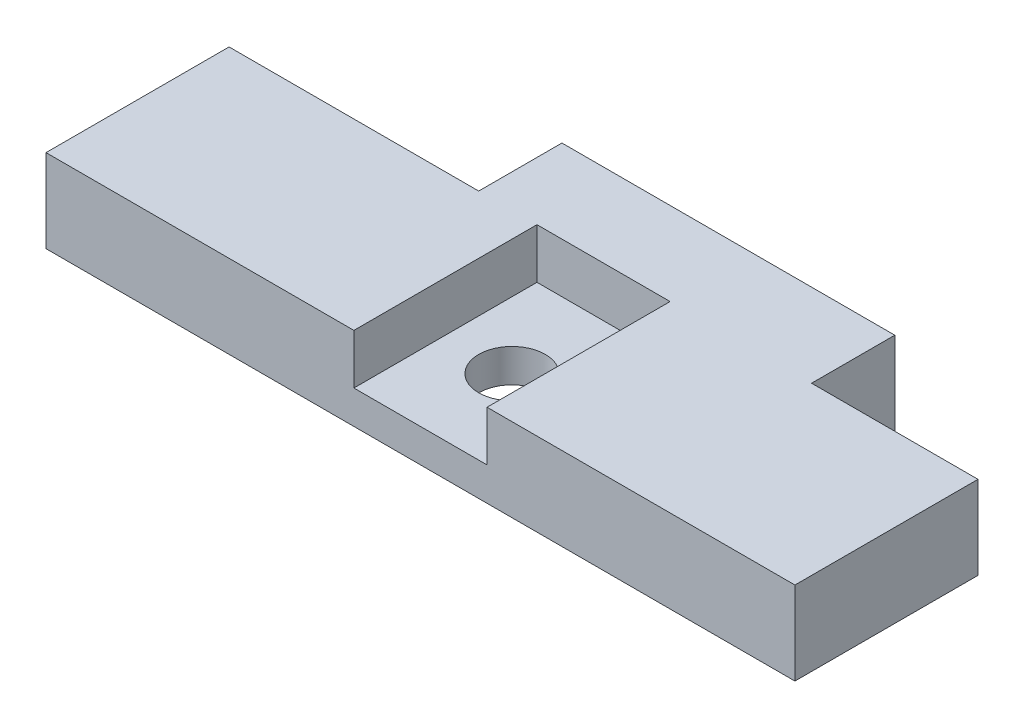
ISO-10303-21;
HEADER;
FILE_DESCRIPTION(('STEP AP214'),'2;1');
FILE_NAME('part.step','',(''),(''),'','','');
FILE_SCHEMA(('AUTOMOTIVE_DESIGN { 1 0 10303 214 1 1 1 1 }'));
ENDSEC;
DATA;
#1=APPLICATION_CONTEXT('core data for automotive mechanical design processes');
#2=APPLICATION_PROTOCOL_DEFINITION('international standard','automotive_design',2000,#1);
#3=PRODUCT_CONTEXT('',#1,'mechanical');
#4=PRODUCT('Part','Part','',(#3));
#5=PRODUCT_RELATED_PRODUCT_CATEGORY('part','',(#4));
#6=PRODUCT_DEFINITION_FORMATION('','',#4);
#7=PRODUCT_DEFINITION_CONTEXT('part definition',#1,'design');
#8=PRODUCT_DEFINITION('design','',#6,#7);
#9=PRODUCT_DEFINITION_SHAPE('','',#8);
#10=(LENGTH_UNIT() NAMED_UNIT(*) SI_UNIT(.MILLI.,.METRE.));
#11=(NAMED_UNIT(*) PLANE_ANGLE_UNIT() SI_UNIT($,.RADIAN.));
#12=(NAMED_UNIT(*) SI_UNIT($,.STERADIAN.) SOLID_ANGLE_UNIT());
#13=UNCERTAINTY_MEASURE_WITH_UNIT(LENGTH_MEASURE(1.E-05),#10,'distance_accuracy_value','');
#14=(GEOMETRIC_REPRESENTATION_CONTEXT(3) GLOBAL_UNCERTAINTY_ASSIGNED_CONTEXT((#13)) GLOBAL_UNIT_ASSIGNED_CONTEXT((#10,
#11,#12)) REPRESENTATION_CONTEXT('',''));
#15=CARTESIAN_POINT('',(0.,0.,0.));
#16=DIRECTION('',(0.,0.,1.));
#17=DIRECTION('',(1.,0.,0.));
#18=AXIS2_PLACEMENT_3D('',#15,#16,#17);
#19=CARTESIAN_POINT('',(-22.5,5.,8.));
#20=DIRECTION('',(0.,0.,-1.));
#21=DIRECTION('',(-1.,0.,0.));
#22=AXIS2_PLACEMENT_3D('',#19,#20,#21);
#23=PLANE('',#22);
#24=DIRECTION('',(0.,1.,0.));
#25=VECTOR('',#24,1.);
#26=CARTESIAN_POINT('',(-4.,2.,8.));
#27=LINE('',#26,#25);
#28=CARTESIAN_POINT('',(-4.,2.,8.));
#29=VERTEX_POINT('',#28);
#30=CARTESIAN_POINT('',(-4.,5.,8.));
#31=VERTEX_POINT('',#30);
#32=EDGE_CURVE('E150',#29,#31,#27,.T.);
#33=ORIENTED_EDGE('',*,*,#32,.T.);
#34=DIRECTION('',(1.,0.,0.));
#35=VECTOR('',#34,1.);
#36=CARTESIAN_POINT('',(-22.5,5.,8.));
#37=LINE('',#36,#35);
#38=CARTESIAN_POINT('',(-22.5,5.,8.));
#39=VERTEX_POINT('',#38);
#40=EDGE_CURVE('E141',#39,#31,#37,.T.);
#41=ORIENTED_EDGE('',*,*,#40,.F.);
#42=DIRECTION('',(0.,-1.,0.));
#43=VECTOR('',#42,1.);
#44=CARTESIAN_POINT('',(-22.5,5.,8.));
#45=LINE('',#44,#43);
#46=CARTESIAN_POINT('',(-22.5,0.,8.));
#47=VERTEX_POINT('',#46);
#48=EDGE_CURVE('E136',#39,#47,#45,.T.);
#49=ORIENTED_EDGE('',*,*,#48,.T.);
#50=DIRECTION('',(1.,0.,0.));
#51=VECTOR('',#50,1.);
#52=CARTESIAN_POINT('',(-22.5,0.,8.));
#53=LINE('',#52,#51);
#54=CARTESIAN_POINT('',(22.5,0.,8.));
#55=VERTEX_POINT('',#54);
#56=EDGE_CURVE('E91',#47,#55,#53,.T.);
#57=ORIENTED_EDGE('',*,*,#56,.T.);
#58=DIRECTION('',(0.,-1.,0.));
#59=VECTOR('',#58,1.);
#60=CARTESIAN_POINT('',(22.5,5.,8.));
#61=LINE('',#60,#59);
#62=CARTESIAN_POINT('',(22.5,5.,8.));
#63=VERTEX_POINT('',#62);
#64=EDGE_CURVE('E145',#63,#55,#61,.T.);
#65=ORIENTED_EDGE('',*,*,#64,.F.);
#66=CARTESIAN_POINT('',(3.99999999999999,5.,8.));
#67=VERTEX_POINT('',#66);
#68=EDGE_CURVE('E57',#67,#63,#37,.T.);
#69=ORIENTED_EDGE('',*,*,#68,.F.);
#70=DIRECTION('',(0.,1.,0.));
#71=VECTOR('',#70,1.);
#72=CARTESIAN_POINT('',(4.,2.,8.));
#73=LINE('',#72,#71);
#74=CARTESIAN_POINT('',(4.,2.,8.));
#75=VERTEX_POINT('',#74);
#76=EDGE_CURVE('E49',#75,#67,#73,.T.);
#77=ORIENTED_EDGE('',*,*,#76,.F.);
#78=DIRECTION('',(1.,0.,0.));
#79=VECTOR('',#78,1.);
#80=CARTESIAN_POINT('',(0.,2.,8.));
#81=LINE('',#80,#79);
#82=EDGE_CURVE('E209',#29,#75,#81,.T.);
#83=ORIENTED_EDGE('',*,*,#82,.F.);
#84=EDGE_LOOP('',(#33,#41,#49,#57,#65,#69,#77,#83));
#85=FACE_BOUND('',#84,.T.);
#86=ADVANCED_FACE('F33',(#85),#23,.F.);
#87=CARTESIAN_POINT('',(0.,5.,0.));
#88=DIRECTION('',(0.,1.,0.));
#89=DIRECTION('',(0.,0.,1.));
#90=AXIS2_PLACEMENT_3D('',#87,#88,#89);
#91=PLANE('',#90);
#92=ORIENTED_EDGE('',*,*,#40,.T.);
#93=DIRECTION('',(0.,0.,-1.));
#94=VECTOR('',#93,1.);
#95=CARTESIAN_POINT('',(-4.,5.,0.));
#96=LINE('',#95,#94);
#97=CARTESIAN_POINT('',(-4.,5.,-3.));
#98=VERTEX_POINT('',#97);
#99=EDGE_CURVE('E206',#31,#98,#96,.T.);
#100=ORIENTED_EDGE('',*,*,#99,.T.);
#101=DIRECTION('',(-1.,0.,0.));
#102=VECTOR('',#101,1.);
#103=CARTESIAN_POINT('',(0.,5.,-3.));
#104=LINE('',#103,#102);
#105=CARTESIAN_POINT('',(4.,5.,-3.));
#106=VERTEX_POINT('',#105);
#107=EDGE_CURVE('E210',#106,#98,#104,.T.);
#108=ORIENTED_EDGE('',*,*,#107,.F.);
#109=DIRECTION('',(0.,0.,-1.));
#110=VECTOR('',#109,1.);
#111=CARTESIAN_POINT('',(4.,5.,0.));
#112=LINE('',#111,#110);
#113=EDGE_CURVE('E213',#67,#106,#112,.T.);
#114=ORIENTED_EDGE('',*,*,#113,.F.);
#115=ORIENTED_EDGE('',*,*,#68,.T.);
#116=DIRECTION('',(0.,0.,-1.));
#117=VECTOR('',#116,1.);
#118=CARTESIAN_POINT('',(22.5,5.,-3.));
#119=LINE('',#118,#117);
#120=CARTESIAN_POINT('',(22.5,5.,-3.));
#121=VERTEX_POINT('',#120);
#122=EDGE_CURVE('E162',#63,#121,#119,.T.);
#123=ORIENTED_EDGE('',*,*,#122,.T.);
#124=DIRECTION('',(-1.,0.,0.));
#125=VECTOR('',#124,1.);
#126=CARTESIAN_POINT('',(12.5,5.,-3.));
#127=LINE('',#126,#125);
#128=CARTESIAN_POINT('',(12.5,5.,-3.));
#129=VERTEX_POINT('',#128);
#130=EDGE_CURVE('E99',#121,#129,#127,.T.);
#131=ORIENTED_EDGE('',*,*,#130,.T.);
#132=DIRECTION('',(0.,0.,-1.));
#133=VECTOR('',#132,1.);
#134=CARTESIAN_POINT('',(12.5,5.,-8.));
#135=LINE('',#134,#133);
#136=CARTESIAN_POINT('',(12.5,5.,-8.));
#137=VERTEX_POINT('',#136);
#138=EDGE_CURVE('E178',#129,#137,#135,.T.);
#139=ORIENTED_EDGE('',*,*,#138,.T.);
#140=DIRECTION('',(-1.,0.,0.));
#141=VECTOR('',#140,1.);
#142=CARTESIAN_POINT('',(-7.50000000000001,5.,-8.));
#143=LINE('',#142,#141);
#144=CARTESIAN_POINT('',(-7.50000000000001,5.,-8.));
#145=VERTEX_POINT('',#144);
#146=EDGE_CURVE('E190',#137,#145,#143,.T.);
#147=ORIENTED_EDGE('',*,*,#146,.T.);
#148=DIRECTION('',(0.,0.,1.));
#149=VECTOR('',#148,1.);
#150=CARTESIAN_POINT('',(-7.50000000000001,5.,-8.));
#151=LINE('',#150,#149);
#152=CARTESIAN_POINT('',(-7.50000000000001,5.,-3.));
#153=VERTEX_POINT('',#152);
#154=EDGE_CURVE('E123',#145,#153,#151,.T.);
#155=ORIENTED_EDGE('',*,*,#154,.T.);
#156=DIRECTION('',(-1.,0.,0.));
#157=VECTOR('',#156,1.);
#158=CARTESIAN_POINT('',(-7.50000000000001,5.,-3.));
#159=LINE('',#158,#157);
#160=CARTESIAN_POINT('',(-22.5,5.,-3.));
#161=VERTEX_POINT('',#160);
#162=EDGE_CURVE('E115',#153,#161,#159,.T.);
#163=ORIENTED_EDGE('',*,*,#162,.T.);
#164=DIRECTION('',(0.,0.,1.));
#165=VECTOR('',#164,1.);
#166=CARTESIAN_POINT('',(-22.5,5.,-3.));
#167=LINE('',#166,#165);
#168=EDGE_CURVE('E120',#161,#39,#167,.T.);
#169=ORIENTED_EDGE('',*,*,#168,.T.);
#170=EDGE_LOOP('',(#92,#100,#108,#114,#115,#123,#131,#139,#147,#155,#163,#169));
#171=FACE_BOUND('',#170,.T.);
#172=ADVANCED_FACE('F118',(#171),#91,.T.);
#173=CARTESIAN_POINT('',(22.5,5.,-3.));
#174=DIRECTION('',(-1.,0.,0.));
#175=DIRECTION('',(0.,0.,1.));
#176=AXIS2_PLACEMENT_3D('',#173,#174,#175);
#177=PLANE('',#176);
#178=DIRECTION('',(0.,0.,-1.));
#179=VECTOR('',#178,1.);
#180=CARTESIAN_POINT('',(22.5,0.,-3.));
#181=LINE('',#180,#179);
#182=CARTESIAN_POINT('',(22.5,0.,-3.));
#183=VERTEX_POINT('',#182);
#184=EDGE_CURVE('E146',#55,#183,#181,.T.);
#185=ORIENTED_EDGE('',*,*,#184,.T.);
#186=DIRECTION('',(0.,-1.,0.));
#187=VECTOR('',#186,1.);
#188=CARTESIAN_POINT('',(22.5,5.,-3.));
#189=LINE('',#188,#187);
#190=EDGE_CURVE('E11',#121,#183,#189,.T.);
#191=ORIENTED_EDGE('',*,*,#190,.F.);
#192=ORIENTED_EDGE('',*,*,#122,.F.);
#193=ORIENTED_EDGE('',*,*,#64,.T.);
#194=EDGE_LOOP('',(#185,#191,#192,#193));
#195=FACE_BOUND('',#194,.T.);
#196=ADVANCED_FACE('F35',(#195),#177,.F.);
#197=CARTESIAN_POINT('',(12.5,5.,-3.));
#198=DIRECTION('',(0.,0.,1.));
#199=DIRECTION('',(1.,0.,0.));
#200=AXIS2_PLACEMENT_3D('',#197,#198,#199);
#201=PLANE('',#200);
#202=DIRECTION('',(-1.,0.,0.));
#203=VECTOR('',#202,1.);
#204=CARTESIAN_POINT('',(12.5,0.,-3.));
#205=LINE('',#204,#203);
#206=CARTESIAN_POINT('',(12.5,0.,-3.));
#207=VERTEX_POINT('',#206);
#208=EDGE_CURVE('E149',#183,#207,#205,.T.);
#209=ORIENTED_EDGE('',*,*,#208,.T.);
#210=DIRECTION('',(0.,-1.,0.));
#211=VECTOR('',#210,1.);
#212=CARTESIAN_POINT('',(12.5,5.,-3.));
#213=LINE('',#212,#211);
#214=EDGE_CURVE('E42',#129,#207,#213,.T.);
#215=ORIENTED_EDGE('',*,*,#214,.F.);
#216=ORIENTED_EDGE('',*,*,#130,.F.);
#217=ORIENTED_EDGE('',*,*,#190,.T.);
#218=EDGE_LOOP('',(#209,#215,#216,#217));
#219=FACE_BOUND('',#218,.T.);
#220=ADVANCED_FACE('F248',(#219),#201,.F.);
#221=CARTESIAN_POINT('',(12.5,5.,-8.));
#222=DIRECTION('',(-1.,0.,0.));
#223=DIRECTION('',(0.,0.,1.));
#224=AXIS2_PLACEMENT_3D('',#221,#222,#223);
#225=PLANE('',#224);
#226=DIRECTION('',(0.,0.,-1.));
#227=VECTOR('',#226,1.);
#228=CARTESIAN_POINT('',(12.5,0.,-8.));
#229=LINE('',#228,#227);
#230=CARTESIAN_POINT('',(12.5,0.,-8.));
#231=VERTEX_POINT('',#230);
#232=EDGE_CURVE('E152',#207,#231,#229,.T.);
#233=ORIENTED_EDGE('',*,*,#232,.T.);
#234=DIRECTION('',(0.,-1.,0.));
#235=VECTOR('',#234,1.);
#236=CARTESIAN_POINT('',(12.5,5.,-8.));
#237=LINE('',#236,#235);
#238=EDGE_CURVE('E169',#137,#231,#237,.T.);
#239=ORIENTED_EDGE('',*,*,#238,.F.);
#240=ORIENTED_EDGE('',*,*,#138,.F.);
#241=ORIENTED_EDGE('',*,*,#214,.T.);
#242=EDGE_LOOP('',(#233,#239,#240,#241));
#243=FACE_BOUND('',#242,.T.);
#244=ADVANCED_FACE('F176',(#243),#225,.F.);
#245=CARTESIAN_POINT('',(-7.50000000000001,5.,-8.));
#246=DIRECTION('',(0.,0.,1.));
#247=DIRECTION('',(1.,0.,0.));
#248=AXIS2_PLACEMENT_3D('',#245,#246,#247);
#249=PLANE('',#248);
#250=DIRECTION('',(-1.,0.,0.));
#251=VECTOR('',#250,1.);
#252=CARTESIAN_POINT('',(-7.50000000000001,0.,-8.));
#253=LINE('',#252,#251);
#254=CARTESIAN_POINT('',(-7.50000000000001,0.,-8.));
#255=VERTEX_POINT('',#254);
#256=EDGE_CURVE('E154',#231,#255,#253,.T.);
#257=ORIENTED_EDGE('',*,*,#256,.T.);
#258=DIRECTION('',(0.,-1.,0.));
#259=VECTOR('',#258,1.);
#260=CARTESIAN_POINT('',(-7.50000000000001,5.,-8.));
#261=LINE('',#260,#259);
#262=EDGE_CURVE('E166',#145,#255,#261,.T.);
#263=ORIENTED_EDGE('',*,*,#262,.F.);
#264=ORIENTED_EDGE('',*,*,#146,.F.);
#265=ORIENTED_EDGE('',*,*,#238,.T.);
#266=EDGE_LOOP('',(#257,#263,#264,#265));
#267=FACE_BOUND('',#266,.T.);
#268=ADVANCED_FACE('F186',(#267),#249,.F.);
#269=CARTESIAN_POINT('',(-7.50000000000001,5.,-8.));
#270=DIRECTION('',(1.,0.,0.));
#271=DIRECTION('',(0.,0.,-1.));
#272=AXIS2_PLACEMENT_3D('',#269,#270,#271);
#273=PLANE('',#272);
#274=DIRECTION('',(0.,0.,1.));
#275=VECTOR('',#274,1.);
#276=CARTESIAN_POINT('',(-7.50000000000001,0.,-8.));
#277=LINE('',#276,#275);
#278=CARTESIAN_POINT('',(-7.50000000000001,0.,-3.));
#279=VERTEX_POINT('',#278);
#280=EDGE_CURVE('E156',#255,#279,#277,.T.);
#281=ORIENTED_EDGE('',*,*,#280,.T.);
#282=DIRECTION('',(0.,-1.,0.));
#283=VECTOR('',#282,1.);
#284=CARTESIAN_POINT('',(-7.50000000000001,5.,-3.));
#285=LINE('',#284,#283);
#286=EDGE_CURVE('E135',#153,#279,#285,.T.);
#287=ORIENTED_EDGE('',*,*,#286,.F.);
#288=ORIENTED_EDGE('',*,*,#154,.F.);
#289=ORIENTED_EDGE('',*,*,#262,.T.);
#290=EDGE_LOOP('',(#281,#287,#288,#289));
#291=FACE_BOUND('',#290,.T.);
#292=ADVANCED_FACE('F189',(#291),#273,.F.);
#293=CARTESIAN_POINT('',(-7.50000000000001,5.,-3.));
#294=DIRECTION('',(0.,0.,1.));
#295=DIRECTION('',(1.,0.,0.));
#296=AXIS2_PLACEMENT_3D('',#293,#294,#295);
#297=PLANE('',#296);
#298=DIRECTION('',(-1.,0.,0.));
#299=VECTOR('',#298,1.);
#300=CARTESIAN_POINT('',(-7.50000000000001,0.,-3.));
#301=LINE('',#300,#299);
#302=CARTESIAN_POINT('',(-22.5,0.,-3.));
#303=VERTEX_POINT('',#302);
#304=EDGE_CURVE('E132',#279,#303,#301,.T.);
#305=ORIENTED_EDGE('',*,*,#304,.T.);
#306=DIRECTION('',(0.,-1.,0.));
#307=VECTOR('',#306,1.);
#308=CARTESIAN_POINT('',(-22.5,5.,-3.));
#309=LINE('',#308,#307);
#310=EDGE_CURVE('E129',#161,#303,#309,.T.);
#311=ORIENTED_EDGE('',*,*,#310,.F.);
#312=ORIENTED_EDGE('',*,*,#162,.F.);
#313=ORIENTED_EDGE('',*,*,#286,.T.);
#314=EDGE_LOOP('',(#305,#311,#312,#313));
#315=FACE_BOUND('',#314,.T.);
#316=ADVANCED_FACE('F130',(#315),#297,.F.);
#317=CARTESIAN_POINT('',(-22.5,5.,-3.));
#318=DIRECTION('',(1.,0.,0.));
#319=DIRECTION('',(0.,0.,-1.));
#320=AXIS2_PLACEMENT_3D('',#317,#318,#319);
#321=PLANE('',#320);
#322=DIRECTION('',(0.,0.,1.));
#323=VECTOR('',#322,1.);
#324=CARTESIAN_POINT('',(-22.5,0.,-3.));
#325=LINE('',#324,#323);
#326=EDGE_CURVE('E159',#303,#47,#325,.T.);
#327=ORIENTED_EDGE('',*,*,#326,.T.);
#328=ORIENTED_EDGE('',*,*,#48,.F.);
#329=ORIENTED_EDGE('',*,*,#168,.F.);
#330=ORIENTED_EDGE('',*,*,#310,.T.);
#331=EDGE_LOOP('',(#327,#328,#329,#330));
#332=FACE_BOUND('',#331,.T.);
#333=ADVANCED_FACE('F138',(#332),#321,.F.);
#334=CARTESIAN_POINT('',(0.,0.,0.));
#335=DIRECTION('',(0.,1.,0.));
#336=DIRECTION('',(0.,0.,1.));
#337=AXIS2_PLACEMENT_3D('',#334,#335,#336);
#338=PLANE('',#337);
#339=CARTESIAN_POINT('',(0.,0.,2.5));
#340=DIRECTION('',(0.,1.,0.));
#341=DIRECTION('',(0.,0.,1.));
#342=AXIS2_PLACEMENT_3D('',#339,#340,#341);
#343=CIRCLE('',#342,2.);
#344=CARTESIAN_POINT('',(0.,0.,4.5));
#345=VERTEX_POINT('',#344);
#346=EDGE_CURVE('E225',#345,#345,#343,.T.);
#347=ORIENTED_EDGE('',*,*,#346,.T.);
#348=EDGE_LOOP('',(#347));
#349=FACE_BOUND('',#348,.T.);
#350=ORIENTED_EDGE('',*,*,#184,.F.);
#351=ORIENTED_EDGE('',*,*,#56,.F.);
#352=ORIENTED_EDGE('',*,*,#326,.F.);
#353=ORIENTED_EDGE('',*,*,#304,.F.);
#354=ORIENTED_EDGE('',*,*,#280,.F.);
#355=ORIENTED_EDGE('',*,*,#256,.F.);
#356=ORIENTED_EDGE('',*,*,#232,.F.);
#357=ORIENTED_EDGE('',*,*,#208,.F.);
#358=EDGE_LOOP('',(#350,#351,#352,#353,#354,#355,#356,#357));
#359=FACE_BOUND('',#358,.T.);
#360=ADVANCED_FACE('F182',(#349,#359),#338,.F.);
#361=CARTESIAN_POINT('',(-4.,2.,0.));
#362=DIRECTION('',(1.,0.,0.));
#363=DIRECTION('',(0.,0.,-1.));
#364=AXIS2_PLACEMENT_3D('',#361,#362,#363);
#365=PLANE('',#364);
#366=ORIENTED_EDGE('',*,*,#99,.F.);
#367=ORIENTED_EDGE('',*,*,#32,.F.);
#368=DIRECTION('',(0.,0.,-1.));
#369=VECTOR('',#368,1.);
#370=CARTESIAN_POINT('',(-4.,2.,0.));
#371=LINE('',#370,#369);
#372=CARTESIAN_POINT('',(-4.,2.,-3.));
#373=VERTEX_POINT('',#372);
#374=EDGE_CURVE('E198',#29,#373,#371,.T.);
#375=ORIENTED_EDGE('',*,*,#374,.T.);
#376=DIRECTION('',(0.,1.,0.));
#377=VECTOR('',#376,1.);
#378=CARTESIAN_POINT('',(-4.,2.,-3.));
#379=LINE('',#378,#377);
#380=EDGE_CURVE('E201',#373,#98,#379,.T.);
#381=ORIENTED_EDGE('',*,*,#380,.T.);
#382=EDGE_LOOP('',(#366,#367,#375,#381));
#383=FACE_BOUND('',#382,.T.);
#384=ADVANCED_FACE('F292',(#383),#365,.T.);
#385=CARTESIAN_POINT('',(0.,2.,-3.));
#386=DIRECTION('',(0.,0.,-1.));
#387=DIRECTION('',(-1.,0.,0.));
#388=AXIS2_PLACEMENT_3D('',#385,#386,#387);
#389=PLANE('',#388);
#390=ORIENTED_EDGE('',*,*,#107,.T.);
#391=ORIENTED_EDGE('',*,*,#380,.F.);
#392=DIRECTION('',(-1.,0.,0.));
#393=VECTOR('',#392,1.);
#394=CARTESIAN_POINT('',(0.,2.,-3.));
#395=LINE('',#394,#393);
#396=CARTESIAN_POINT('',(4.,2.,-3.));
#397=VERTEX_POINT('',#396);
#398=EDGE_CURVE('E217',#397,#373,#395,.T.);
#399=ORIENTED_EDGE('',*,*,#398,.F.);
#400=DIRECTION('',(0.,1.,0.));
#401=VECTOR('',#400,1.);
#402=CARTESIAN_POINT('',(4.,2.,-3.));
#403=LINE('',#402,#401);
#404=EDGE_CURVE('E197',#397,#106,#403,.T.);
#405=ORIENTED_EDGE('',*,*,#404,.T.);
#406=EDGE_LOOP('',(#390,#391,#399,#405));
#407=FACE_BOUND('',#406,.T.);
#408=ADVANCED_FACE('F300',(#407),#389,.F.);
#409=CARTESIAN_POINT('',(4.,2.,0.));
#410=DIRECTION('',(1.,0.,0.));
#411=DIRECTION('',(0.,0.,-1.));
#412=AXIS2_PLACEMENT_3D('',#409,#410,#411);
#413=PLANE('',#412);
#414=ORIENTED_EDGE('',*,*,#113,.T.);
#415=ORIENTED_EDGE('',*,*,#404,.F.);
#416=DIRECTION('',(0.,0.,-1.));
#417=VECTOR('',#416,1.);
#418=CARTESIAN_POINT('',(4.,2.,0.));
#419=LINE('',#418,#417);
#420=EDGE_CURVE('E220',#75,#397,#419,.T.);
#421=ORIENTED_EDGE('',*,*,#420,.F.);
#422=ORIENTED_EDGE('',*,*,#76,.T.);
#423=EDGE_LOOP('',(#414,#415,#421,#422));
#424=FACE_BOUND('',#423,.T.);
#425=ADVANCED_FACE('F238',(#424),#413,.F.);
#426=CARTESIAN_POINT('',(0.,2.,0.));
#427=DIRECTION('',(0.,1.,0.));
#428=DIRECTION('',(0.,0.,1.));
#429=AXIS2_PLACEMENT_3D('',#426,#427,#428);
#430=PLANE('',#429);
#431=CARTESIAN_POINT('',(0.,2.,2.5));
#432=DIRECTION('',(0.,1.,0.));
#433=DIRECTION('',(0.,0.,1.));
#434=AXIS2_PLACEMENT_3D('',#431,#432,#433);
#435=CIRCLE('',#434,2.);
#436=CARTESIAN_POINT('',(0.,2.,4.5));
#437=VERTEX_POINT('',#436);
#438=EDGE_CURVE('E37',#437,#437,#435,.T.);
#439=ORIENTED_EDGE('',*,*,#438,.F.);
#440=EDGE_LOOP('',(#439));
#441=FACE_BOUND('',#440,.T.);
#442=ORIENTED_EDGE('',*,*,#82,.T.);
#443=ORIENTED_EDGE('',*,*,#420,.T.);
#444=ORIENTED_EDGE('',*,*,#398,.T.);
#445=ORIENTED_EDGE('',*,*,#374,.F.);
#446=EDGE_LOOP('',(#442,#443,#444,#445));
#447=FACE_BOUND('',#446,.T.);
#448=ADVANCED_FACE('F235',(#441,#447),#430,.T.);
#449=CARTESIAN_POINT('',(0.,0.,2.5));
#450=DIRECTION('',(0.,1.,0.));
#451=DIRECTION('',(0.,0.,1.));
#452=AXIS2_PLACEMENT_3D('',#449,#450,#451);
#453=CYLINDRICAL_SURFACE('',#452,2.);
#454=ORIENTED_EDGE('',*,*,#438,.T.);
#455=EDGE_LOOP('',(#454));
#456=FACE_BOUND('',#455,.T.);
#457=ORIENTED_EDGE('',*,*,#346,.F.);
#458=EDGE_LOOP('',(#457));
#459=FACE_BOUND('',#458,.T.);
#460=ADVANCED_FACE('F232',(#456,#459),#453,.F.);
#461=CLOSED_SHELL('',(#86,#172,#196,#220,#244,#268,#292,#316,#333,#360,#384,#408,#425,#448,#460));
#462=MANIFOLD_SOLID_BREP('B2',#461);
#463=ADVANCED_BREP_SHAPE_REPRESENTATION('',(#18,#462),#14);
#464=SHAPE_DEFINITION_REPRESENTATION(#9,#463);
ENDSEC;
END-ISO-10303-21;
